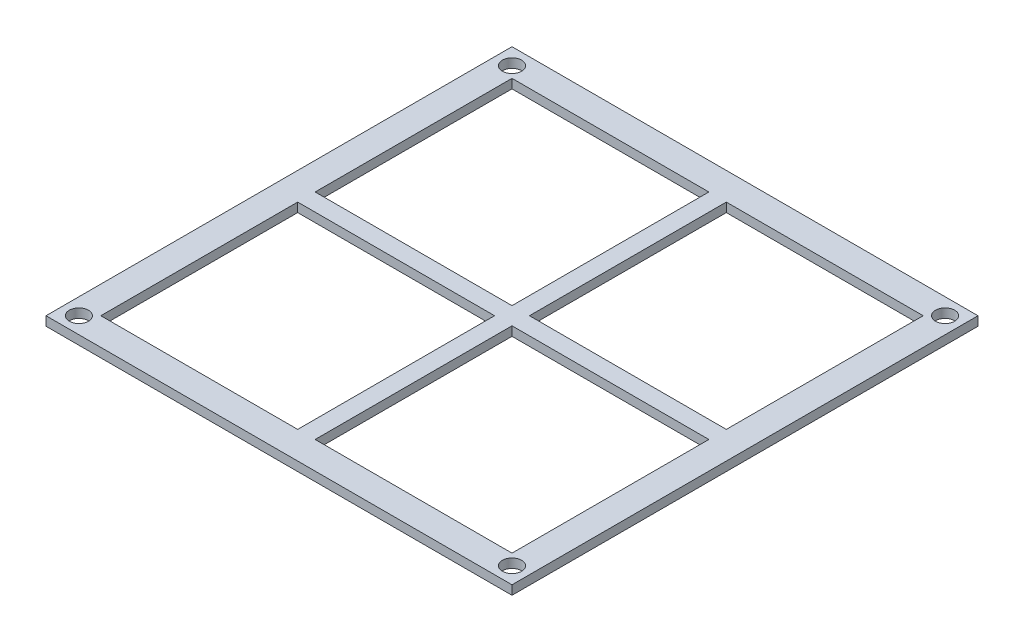
ISO-10303-21;
HEADER;
FILE_DESCRIPTION(('STEP AP214'),'2;1');
FILE_NAME('part.step','',(''),(''),'','','');
FILE_SCHEMA(('AUTOMOTIVE_DESIGN { 1 0 10303 214 1 1 1 1 }'));
ENDSEC;
DATA;
#1=APPLICATION_CONTEXT('core data for automotive mechanical design processes');
#2=APPLICATION_PROTOCOL_DEFINITION('international standard','automotive_design',2000,#1);
#3=PRODUCT_CONTEXT('',#1,'mechanical');
#4=PRODUCT('Part','Part','',(#3));
#5=PRODUCT_RELATED_PRODUCT_CATEGORY('part','',(#4));
#6=PRODUCT_DEFINITION_FORMATION('','',#4);
#7=PRODUCT_DEFINITION_CONTEXT('part definition',#1,'design');
#8=PRODUCT_DEFINITION('design','',#6,#7);
#9=PRODUCT_DEFINITION_SHAPE('','',#8);
#10=(LENGTH_UNIT() NAMED_UNIT(*) SI_UNIT(.MILLI.,.METRE.));
#11=(NAMED_UNIT(*) PLANE_ANGLE_UNIT() SI_UNIT($,.RADIAN.));
#12=(NAMED_UNIT(*) SI_UNIT($,.STERADIAN.) SOLID_ANGLE_UNIT());
#13=UNCERTAINTY_MEASURE_WITH_UNIT(LENGTH_MEASURE(1.E-05),#10,'distance_accuracy_value','');
#14=(GEOMETRIC_REPRESENTATION_CONTEXT(3) GLOBAL_UNCERTAINTY_ASSIGNED_CONTEXT((#13)) GLOBAL_UNIT_ASSIGNED_CONTEXT((#10,
#11,#12)) REPRESENTATION_CONTEXT('',''));
#15=CARTESIAN_POINT('',(0.,0.,0.));
#16=DIRECTION('',(0.,0.,1.));
#17=DIRECTION('',(1.,0.,0.));
#18=AXIS2_PLACEMENT_3D('',#15,#16,#17);
#19=CARTESIAN_POINT('',(0.,0.,0.));
#20=DIRECTION('',(0.,1.,0.));
#21=DIRECTION('',(0.,0.,1.));
#22=AXIS2_PLACEMENT_3D('',#19,#20,#21);
#23=PLANE('',#22);
#24=DIRECTION('',(-1.,0.,0.));
#25=VECTOR('',#24,1.);
#26=CARTESIAN_POINT('',(0.,0.,57.15));
#27=LINE('',#26,#25);
#28=CARTESIAN_POINT('',(-2.4263497335326,0.,57.15));
#29=VERTEX_POINT('',#28);
#30=CARTESIAN_POINT('',(-57.15,0.,57.15));
#31=VERTEX_POINT('',#30);
#32=EDGE_CURVE('E479',#29,#31,#27,.T.);
#33=ORIENTED_EDGE('',*,*,#32,.F.);
#34=DIRECTION('',(0.,0.,-1.));
#35=VECTOR('',#34,1.);
#36=CARTESIAN_POINT('',(-2.4263497335326,0.,0.));
#37=LINE('',#36,#35);
#38=CARTESIAN_POINT('',(-2.4263497335326,0.,2.4263497335326));
#39=VERTEX_POINT('',#38);
#40=EDGE_CURVE('E580',#29,#39,#37,.T.);
#41=ORIENTED_EDGE('',*,*,#40,.T.);
#42=DIRECTION('',(-1.,0.,0.));
#43=VECTOR('',#42,1.);
#44=CARTESIAN_POINT('',(0.,0.,2.4263497335326));
#45=LINE('',#44,#43);
#46=CARTESIAN_POINT('',(-57.15,0.,2.4263497335326));
#47=VERTEX_POINT('',#46);
#48=EDGE_CURVE('E471',#39,#47,#45,.T.);
#49=ORIENTED_EDGE('',*,*,#48,.T.);
#50=DIRECTION('',(0.,0.,-1.));
#51=VECTOR('',#50,1.);
#52=CARTESIAN_POINT('',(-57.15,0.,0.));
#53=LINE('',#52,#51);
#54=EDGE_CURVE('E476',#31,#47,#53,.T.);
#55=ORIENTED_EDGE('',*,*,#54,.F.);
#56=EDGE_LOOP('',(#33,#41,#49,#55));
#57=FACE_BOUND('',#56,.T.);
#58=DIRECTION('',(-1.,0.,0.));
#59=VECTOR('',#58,1.);
#60=CARTESIAN_POINT('',(0.,0.,-2.42634973353261));
#61=LINE('',#60,#59);
#62=CARTESIAN_POINT('',(-2.4263497335326,0.,-2.42634973353261));
#63=VERTEX_POINT('',#62);
#64=CARTESIAN_POINT('',(-57.15,0.,-2.42634973353261));
#65=VERTEX_POINT('',#64);
#66=EDGE_CURVE('E459',#63,#65,#61,.T.);
#67=ORIENTED_EDGE('',*,*,#66,.F.);
#68=DIRECTION('',(0.,0.,-1.));
#69=VECTOR('',#68,1.);
#70=CARTESIAN_POINT('',(-2.4263497335326,0.,64.77));
#71=LINE('',#70,#69);
#72=CARTESIAN_POINT('',(-2.4263497335326,0.,-57.15));
#73=VERTEX_POINT('',#72);
#74=EDGE_CURVE('E259',#63,#73,#71,.T.);
#75=ORIENTED_EDGE('',*,*,#74,.T.);
#76=DIRECTION('',(-1.,0.,0.));
#77=VECTOR('',#76,1.);
#78=CARTESIAN_POINT('',(0.,0.,-57.15));
#79=LINE('',#78,#77);
#80=CARTESIAN_POINT('',(-57.15,0.,-57.15));
#81=VERTEX_POINT('',#80);
#82=EDGE_CURVE('E416',#73,#81,#79,.T.);
#83=ORIENTED_EDGE('',*,*,#82,.T.);
#84=DIRECTION('',(0.,0.,-1.));
#85=VECTOR('',#84,1.);
#86=CARTESIAN_POINT('',(-57.15,0.,0.));
#87=LINE('',#86,#85);
#88=EDGE_CURVE('E422',#65,#81,#87,.T.);
#89=ORIENTED_EDGE('',*,*,#88,.F.);
#90=EDGE_LOOP('',(#67,#75,#83,#89));
#91=FACE_BOUND('',#90,.T.);
#92=DIRECTION('',(0.,0.,-1.));
#93=VECTOR('',#92,1.);
#94=CARTESIAN_POINT('',(2.42634973353263,0.,0.));
#95=LINE('',#94,#93);
#96=CARTESIAN_POINT('',(2.42634973353263,0.,57.15));
#97=VERTEX_POINT('',#96);
#98=CARTESIAN_POINT('',(2.42634973353263,0.,2.4263497335326));
#99=VERTEX_POINT('',#98);
#100=EDGE_CURVE('E506',#97,#99,#95,.T.);
#101=ORIENTED_EDGE('',*,*,#100,.F.);
#102=DIRECTION('',(-1.,0.,0.));
#103=VECTOR('',#102,1.);
#104=CARTESIAN_POINT('',(0.,0.,57.15));
#105=LINE('',#104,#103);
#106=CARTESIAN_POINT('',(57.15,0.,57.15));
#107=VERTEX_POINT('',#106);
#108=EDGE_CURVE('E526',#107,#97,#105,.T.);
#109=ORIENTED_EDGE('',*,*,#108,.F.);
#110=DIRECTION('',(0.,0.,-1.));
#111=VECTOR('',#110,1.);
#112=CARTESIAN_POINT('',(57.15,0.,0.));
#113=LINE('',#112,#111);
#114=CARTESIAN_POINT('',(57.15,0.,2.4263497335326));
#115=VERTEX_POINT('',#114);
#116=EDGE_CURVE('E529',#107,#115,#113,.T.);
#117=ORIENTED_EDGE('',*,*,#116,.T.);
#118=DIRECTION('',(-1.,0.,0.));
#119=VECTOR('',#118,1.);
#120=CARTESIAN_POINT('',(0.,0.,2.4263497335326));
#121=LINE('',#120,#119);
#122=EDGE_CURVE('E532',#115,#99,#121,.T.);
#123=ORIENTED_EDGE('',*,*,#122,.T.);
#124=EDGE_LOOP('',(#101,#109,#117,#123));
#125=FACE_BOUND('',#124,.T.);
#126=DIRECTION('',(0.,0.,-1.));
#127=VECTOR('',#126,1.);
#128=CARTESIAN_POINT('',(-64.77,0.,0.));
#129=LINE('',#128,#127);
#130=CARTESIAN_POINT('',(-64.77,0.,64.77));
#131=VERTEX_POINT('',#130);
#132=CARTESIAN_POINT('',(-64.77,0.,-64.77));
#133=VERTEX_POINT('',#132);
#134=EDGE_CURVE('E397',#131,#133,#129,.T.);
#135=ORIENTED_EDGE('',*,*,#134,.T.);
#136=DIRECTION('',(-1.,0.,0.));
#137=VECTOR('',#136,1.);
#138=CARTESIAN_POINT('',(0.,0.,-64.77));
#139=LINE('',#138,#137);
#140=CARTESIAN_POINT('',(64.77,0.,-64.77));
#141=VERTEX_POINT('',#140);
#142=EDGE_CURVE('E386',#141,#133,#139,.T.);
#143=ORIENTED_EDGE('',*,*,#142,.F.);
#144=DIRECTION('',(0.,0.,-1.));
#145=VECTOR('',#144,1.);
#146=CARTESIAN_POINT('',(64.77,0.,0.));
#147=LINE('',#146,#145);
#148=CARTESIAN_POINT('',(64.77,0.,64.77));
#149=VERTEX_POINT('',#148);
#150=EDGE_CURVE('E399',#149,#141,#147,.T.);
#151=ORIENTED_EDGE('',*,*,#150,.F.);
#152=DIRECTION('',(-1.,0.,0.));
#153=VECTOR('',#152,1.);
#154=CARTESIAN_POINT('',(0.,0.,64.77));
#155=LINE('',#154,#153);
#156=EDGE_CURVE('E393',#149,#131,#155,.T.);
#157=ORIENTED_EDGE('',*,*,#156,.T.);
#158=EDGE_LOOP('',(#135,#143,#151,#157));
#159=FACE_BOUND('',#158,.T.);
#160=DIRECTION('',(-1.,0.,0.));
#161=VECTOR('',#160,1.);
#162=CARTESIAN_POINT('',(0.,0.,-57.15));
#163=LINE('',#162,#161);
#164=CARTESIAN_POINT('',(57.15,0.,-57.15));
#165=VERTEX_POINT('',#164);
#166=CARTESIAN_POINT('',(2.42634973353263,0.,-57.15));
#167=VERTEX_POINT('',#166);
#168=EDGE_CURVE('E541',#165,#167,#163,.T.);
#169=ORIENTED_EDGE('',*,*,#168,.T.);
#170=DIRECTION('',(0.,0.,-1.));
#171=VECTOR('',#170,1.);
#172=CARTESIAN_POINT('',(2.42634973353263,0.,64.77));
#173=LINE('',#172,#171);
#174=CARTESIAN_POINT('',(2.42634973353263,0.,-2.42634973353261));
#175=VERTEX_POINT('',#174);
#176=EDGE_CURVE('E447',#175,#167,#173,.T.);
#177=ORIENTED_EDGE('',*,*,#176,.F.);
#178=DIRECTION('',(-1.,0.,0.));
#179=VECTOR('',#178,1.);
#180=CARTESIAN_POINT('',(0.,0.,-2.42634973353261));
#181=LINE('',#180,#179);
#182=CARTESIAN_POINT('',(57.15,0.,-2.42634973353261));
#183=VERTEX_POINT('',#182);
#184=EDGE_CURVE('E535',#183,#175,#181,.T.);
#185=ORIENTED_EDGE('',*,*,#184,.F.);
#186=DIRECTION('',(0.,0.,-1.));
#187=VECTOR('',#186,1.);
#188=CARTESIAN_POINT('',(57.15,0.,0.));
#189=LINE('',#188,#187);
#190=EDGE_CURVE('E538',#183,#165,#189,.T.);
#191=ORIENTED_EDGE('',*,*,#190,.T.);
#192=EDGE_LOOP('',(#169,#177,#185,#191));
#193=FACE_BOUND('',#192,.T.);
#194=CARTESIAN_POINT('',(60.198,0.,60.198));
#195=DIRECTION('',(0.,1.,0.));
#196=DIRECTION('',(0.,0.,1.));
#197=AXIS2_PLACEMENT_3D('',#194,#195,#196);
#198=CIRCLE('',#197,2.667);
#199=CARTESIAN_POINT('',(60.198,0.,62.865));
#200=VERTEX_POINT('',#199);
#201=EDGE_CURVE('E401',#200,#200,#198,.T.);
#202=ORIENTED_EDGE('',*,*,#201,.T.);
#203=EDGE_LOOP('',(#202));
#204=FACE_BOUND('',#203,.T.);
#205=CARTESIAN_POINT('',(60.198,0.,-60.198));
#206=DIRECTION('',(0.,1.,0.));
#207=DIRECTION('',(0.,0.,1.));
#208=AXIS2_PLACEMENT_3D('',#205,#206,#207);
#209=CIRCLE('',#208,2.667);
#210=CARTESIAN_POINT('',(60.198,0.,-57.531));
#211=VERTEX_POINT('',#210);
#212=EDGE_CURVE('E522',#211,#211,#209,.T.);
#213=ORIENTED_EDGE('',*,*,#212,.T.);
#214=EDGE_LOOP('',(#213));
#215=FACE_BOUND('',#214,.T.);
#216=CARTESIAN_POINT('',(-60.198,0.,60.198));
#217=DIRECTION('',(0.,1.,0.));
#218=DIRECTION('',(0.,0.,1.));
#219=AXIS2_PLACEMENT_3D('',#216,#217,#218);
#220=CIRCLE('',#219,2.667);
#221=CARTESIAN_POINT('',(-60.198,0.,62.865));
#222=VERTEX_POINT('',#221);
#223=EDGE_CURVE('E446',#222,#222,#220,.T.);
#224=ORIENTED_EDGE('',*,*,#223,.T.);
#225=EDGE_LOOP('',(#224));
#226=FACE_BOUND('',#225,.T.);
#227=CARTESIAN_POINT('',(-60.198,0.,-60.198));
#228=DIRECTION('',(0.,1.,0.));
#229=DIRECTION('',(0.,0.,1.));
#230=AXIS2_PLACEMENT_3D('',#227,#228,#229);
#231=CIRCLE('',#230,2.667);
#232=CARTESIAN_POINT('',(-60.198,0.,-57.531));
#233=VERTEX_POINT('',#232);
#234=EDGE_CURVE('E415',#233,#233,#231,.T.);
#235=ORIENTED_EDGE('',*,*,#234,.T.);
#236=EDGE_LOOP('',(#235));
#237=FACE_BOUND('',#236,.T.);
#238=ADVANCED_FACE('F255',(#57,#91,#125,#159,#193,#204,#215,#226,#237),#23,.F.);
#239=CARTESIAN_POINT('',(2.42634973353263,2.54,0.));
#240=DIRECTION('',(-1.,0.,0.));
#241=DIRECTION('',(0.,0.,1.));
#242=AXIS2_PLACEMENT_3D('',#239,#240,#241);
#243=PLANE('',#242);
#244=ORIENTED_EDGE('',*,*,#100,.T.);
#245=DIRECTION('',(0.,-1.,0.));
#246=VECTOR('',#245,1.);
#247=CARTESIAN_POINT('',(2.42634973353263,2.54,2.4263497335326));
#248=LINE('',#247,#246);
#249=CARTESIAN_POINT('',(2.42634973353263,2.54,2.4263497335326));
#250=VERTEX_POINT('',#249);
#251=EDGE_CURVE('E265',#250,#99,#248,.T.);
#252=ORIENTED_EDGE('',*,*,#251,.F.);
#253=DIRECTION('',(0.,0.,-1.));
#254=VECTOR('',#253,1.);
#255=CARTESIAN_POINT('',(2.42634973353263,2.54,0.));
#256=LINE('',#255,#254);
#257=CARTESIAN_POINT('',(2.42634973353263,2.54,57.15));
#258=VERTEX_POINT('',#257);
#259=EDGE_CURVE('E583',#258,#250,#256,.T.);
#260=ORIENTED_EDGE('',*,*,#259,.F.);
#261=DIRECTION('',(0.,-1.,0.));
#262=VECTOR('',#261,1.);
#263=CARTESIAN_POINT('',(2.42634973353263,2.54,57.15));
#264=LINE('',#263,#262);
#265=EDGE_CURVE('E12',#258,#97,#264,.T.);
#266=ORIENTED_EDGE('',*,*,#265,.T.);
#267=EDGE_LOOP('',(#244,#252,#260,#266));
#268=FACE_BOUND('',#267,.T.);
#269=ADVANCED_FACE('F597',(#268),#243,.F.);
#270=CARTESIAN_POINT('',(-2.4263497335326,2.54,0.));
#271=DIRECTION('',(-1.,0.,0.));
#272=DIRECTION('',(0.,0.,1.));
#273=AXIS2_PLACEMENT_3D('',#270,#271,#272);
#274=PLANE('',#273);
#275=ORIENTED_EDGE('',*,*,#40,.F.);
#276=DIRECTION('',(0.,-1.,0.));
#277=VECTOR('',#276,1.);
#278=CARTESIAN_POINT('',(-2.4263497335326,2.54,57.15));
#279=LINE('',#278,#277);
#280=CARTESIAN_POINT('',(-2.4263497335326,2.54,57.15));
#281=VERTEX_POINT('',#280);
#282=EDGE_CURVE('E274',#281,#29,#279,.T.);
#283=ORIENTED_EDGE('',*,*,#282,.F.);
#284=DIRECTION('',(0.,0.,-1.));
#285=VECTOR('',#284,1.);
#286=CARTESIAN_POINT('',(-2.4263497335326,2.54,0.));
#287=LINE('',#286,#285);
#288=CARTESIAN_POINT('',(-2.4263497335326,2.54,2.4263497335326));
#289=VERTEX_POINT('',#288);
#290=EDGE_CURVE('E579',#281,#289,#287,.T.);
#291=ORIENTED_EDGE('',*,*,#290,.T.);
#292=DIRECTION('',(0.,-1.,0.));
#293=VECTOR('',#292,1.);
#294=CARTESIAN_POINT('',(-2.4263497335326,2.54,2.4263497335326));
#295=LINE('',#294,#293);
#296=EDGE_CURVE('E576',#289,#39,#295,.T.);
#297=ORIENTED_EDGE('',*,*,#296,.T.);
#298=EDGE_LOOP('',(#275,#283,#291,#297));
#299=FACE_BOUND('',#298,.T.);
#300=ADVANCED_FACE('F626',(#299),#274,.T.);
#301=CARTESIAN_POINT('',(0.,2.54,0.));
#302=DIRECTION('',(0.,1.,0.));
#303=DIRECTION('',(0.,0.,1.));
#304=AXIS2_PLACEMENT_3D('',#301,#302,#303);
#305=PLANE('',#304);
#306=ORIENTED_EDGE('',*,*,#290,.F.);
#307=DIRECTION('',(-1.,0.,0.));
#308=VECTOR('',#307,1.);
#309=CARTESIAN_POINT('',(0.,2.54,57.15));
#310=LINE('',#309,#308);
#311=CARTESIAN_POINT('',(-57.15,2.54,57.15));
#312=VERTEX_POINT('',#311);
#313=EDGE_CURVE('E499',#281,#312,#310,.T.);
#314=ORIENTED_EDGE('',*,*,#313,.T.);
#315=DIRECTION('',(0.,0.,-1.));
#316=VECTOR('',#315,1.);
#317=CARTESIAN_POINT('',(-57.15,2.54,0.));
#318=LINE('',#317,#316);
#319=CARTESIAN_POINT('',(-57.15,2.54,2.4263497335326));
#320=VERTEX_POINT('',#319);
#321=EDGE_CURVE('E497',#312,#320,#318,.T.);
#322=ORIENTED_EDGE('',*,*,#321,.T.);
#323=DIRECTION('',(-1.,0.,0.));
#324=VECTOR('',#323,1.);
#325=CARTESIAN_POINT('',(0.,2.54,2.4263497335326));
#326=LINE('',#325,#324);
#327=EDGE_CURVE('E494',#289,#320,#326,.T.);
#328=ORIENTED_EDGE('',*,*,#327,.F.);
#329=EDGE_LOOP('',(#306,#314,#322,#328));
#330=FACE_BOUND('',#329,.T.);
#331=DIRECTION('',(0.,0.,-1.));
#332=VECTOR('',#331,1.);
#333=CARTESIAN_POINT('',(-2.4263497335326,2.54,64.77));
#334=LINE('',#333,#332);
#335=CARTESIAN_POINT('',(-2.4263497335326,2.54,-2.42634973353261));
#336=VERTEX_POINT('',#335);
#337=CARTESIAN_POINT('',(-2.4263497335326,2.54,-57.15));
#338=VERTEX_POINT('',#337);
#339=EDGE_CURVE('E444',#336,#338,#334,.T.);
#340=ORIENTED_EDGE('',*,*,#339,.F.);
#341=DIRECTION('',(-1.,0.,0.));
#342=VECTOR('',#341,1.);
#343=CARTESIAN_POINT('',(0.,2.54,-2.42634973353261));
#344=LINE('',#343,#342);
#345=CARTESIAN_POINT('',(-57.15,2.54,-2.42634973353261));
#346=VERTEX_POINT('',#345);
#347=EDGE_CURVE('E491',#336,#346,#344,.T.);
#348=ORIENTED_EDGE('',*,*,#347,.T.);
#349=DIRECTION('',(0.,0.,-1.));
#350=VECTOR('',#349,1.);
#351=CARTESIAN_POINT('',(-57.15,2.54,0.));
#352=LINE('',#351,#350);
#353=CARTESIAN_POINT('',(-57.15,2.54,-57.15));
#354=VERTEX_POINT('',#353);
#355=EDGE_CURVE('E489',#346,#354,#352,.T.);
#356=ORIENTED_EDGE('',*,*,#355,.T.);
#357=DIRECTION('',(-1.,0.,0.));
#358=VECTOR('',#357,1.);
#359=CARTESIAN_POINT('',(0.,2.54,-57.15));
#360=LINE('',#359,#358);
#361=EDGE_CURVE('E467',#338,#354,#360,.T.);
#362=ORIENTED_EDGE('',*,*,#361,.F.);
#363=EDGE_LOOP('',(#340,#348,#356,#362));
#364=FACE_BOUND('',#363,.T.);
#365=DIRECTION('',(-1.,0.,0.));
#366=VECTOR('',#365,1.);
#367=CARTESIAN_POINT('',(0.,2.54,57.15));
#368=LINE('',#367,#366);
#369=CARTESIAN_POINT('',(57.15,2.54,57.15));
#370=VERTEX_POINT('',#369);
#371=EDGE_CURVE('E549',#370,#258,#368,.T.);
#372=ORIENTED_EDGE('',*,*,#371,.T.);
#373=ORIENTED_EDGE('',*,*,#259,.T.);
#374=DIRECTION('',(-1.,0.,0.));
#375=VECTOR('',#374,1.);
#376=CARTESIAN_POINT('',(0.,2.54,2.4263497335326));
#377=LINE('',#376,#375);
#378=CARTESIAN_POINT('',(57.15,2.54,2.4263497335326));
#379=VERTEX_POINT('',#378);
#380=EDGE_CURVE('E555',#379,#250,#377,.T.);
#381=ORIENTED_EDGE('',*,*,#380,.F.);
#382=DIRECTION('',(0.,0.,-1.));
#383=VECTOR('',#382,1.);
#384=CARTESIAN_POINT('',(57.15,2.54,0.));
#385=LINE('',#384,#383);
#386=EDGE_CURVE('E552',#370,#379,#385,.T.);
#387=ORIENTED_EDGE('',*,*,#386,.F.);
#388=EDGE_LOOP('',(#372,#373,#381,#387));
#389=FACE_BOUND('',#388,.T.);
#390=DIRECTION('',(-1.,0.,0.));
#391=VECTOR('',#390,1.);
#392=CARTESIAN_POINT('',(0.,2.54,-64.77));
#393=LINE('',#392,#391);
#394=CARTESIAN_POINT('',(64.77,2.54,-64.77));
#395=VERTEX_POINT('',#394);
#396=CARTESIAN_POINT('',(-64.77,2.54,-64.77));
#397=VERTEX_POINT('',#396);
#398=EDGE_CURVE('E567',#395,#397,#393,.T.);
#399=ORIENTED_EDGE('',*,*,#398,.T.);
#400=DIRECTION('',(0.,0.,-1.));
#401=VECTOR('',#400,1.);
#402=CARTESIAN_POINT('',(-64.77,2.54,0.));
#403=LINE('',#402,#401);
#404=CARTESIAN_POINT('',(-64.77,2.54,64.77));
#405=VERTEX_POINT('',#404);
#406=EDGE_CURVE('E486',#405,#397,#403,.T.);
#407=ORIENTED_EDGE('',*,*,#406,.F.);
#408=DIRECTION('',(-1.,0.,0.));
#409=VECTOR('',#408,1.);
#410=CARTESIAN_POINT('',(0.,2.54,64.77));
#411=LINE('',#410,#409);
#412=CARTESIAN_POINT('',(64.77,2.54,64.77));
#413=VERTEX_POINT('',#412);
#414=EDGE_CURVE('E407',#413,#405,#411,.T.);
#415=ORIENTED_EDGE('',*,*,#414,.F.);
#416=DIRECTION('',(0.,0.,-1.));
#417=VECTOR('',#416,1.);
#418=CARTESIAN_POINT('',(64.77,2.54,0.));
#419=LINE('',#418,#417);
#420=EDGE_CURVE('E569',#413,#395,#419,.T.);
#421=ORIENTED_EDGE('',*,*,#420,.T.);
#422=EDGE_LOOP('',(#399,#407,#415,#421));
#423=FACE_BOUND('',#422,.T.);
#424=DIRECTION('',(0.,0.,-1.));
#425=VECTOR('',#424,1.);
#426=CARTESIAN_POINT('',(2.42634973353263,2.54,64.77));
#427=LINE('',#426,#425);
#428=CARTESIAN_POINT('',(2.42634973353263,2.54,-2.42634973353261));
#429=VERTEX_POINT('',#428);
#430=CARTESIAN_POINT('',(2.42634973353263,2.54,-57.15));
#431=VERTEX_POINT('',#430);
#432=EDGE_CURVE('E441',#429,#431,#427,.T.);
#433=ORIENTED_EDGE('',*,*,#432,.T.);
#434=DIRECTION('',(-1.,0.,0.));
#435=VECTOR('',#434,1.);
#436=CARTESIAN_POINT('',(0.,2.54,-57.15));
#437=LINE('',#436,#435);
#438=CARTESIAN_POINT('',(57.15,2.54,-57.15));
#439=VERTEX_POINT('',#438);
#440=EDGE_CURVE('E564',#439,#431,#437,.T.);
#441=ORIENTED_EDGE('',*,*,#440,.F.);
#442=DIRECTION('',(0.,0.,-1.));
#443=VECTOR('',#442,1.);
#444=CARTESIAN_POINT('',(57.15,2.54,0.));
#445=LINE('',#444,#443);
#446=CARTESIAN_POINT('',(57.15,2.54,-2.42634973353261));
#447=VERTEX_POINT('',#446);
#448=EDGE_CURVE('E561',#447,#439,#445,.T.);
#449=ORIENTED_EDGE('',*,*,#448,.F.);
#450=DIRECTION('',(-1.,0.,0.));
#451=VECTOR('',#450,1.);
#452=CARTESIAN_POINT('',(0.,2.54,-2.42634973353261));
#453=LINE('',#452,#451);
#454=EDGE_CURVE('E558',#447,#429,#453,.T.);
#455=ORIENTED_EDGE('',*,*,#454,.T.);
#456=EDGE_LOOP('',(#433,#441,#449,#455));
#457=FACE_BOUND('',#456,.T.);
#458=CARTESIAN_POINT('',(60.198,2.54,60.198));
#459=DIRECTION('',(0.,1.,0.));
#460=DIRECTION('',(0.,0.,1.));
#461=AXIS2_PLACEMENT_3D('',#458,#459,#460);
#462=CIRCLE('',#461,2.667);
#463=CARTESIAN_POINT('',(60.198,2.54,62.865));
#464=VERTEX_POINT('',#463);
#465=EDGE_CURVE('E525',#464,#464,#462,.T.);
#466=ORIENTED_EDGE('',*,*,#465,.F.);
#467=EDGE_LOOP('',(#466));
#468=FACE_BOUND('',#467,.T.);
#469=CARTESIAN_POINT('',(60.198,2.54,-60.198));
#470=DIRECTION('',(0.,1.,0.));
#471=DIRECTION('',(0.,0.,1.));
#472=AXIS2_PLACEMENT_3D('',#469,#470,#471);
#473=CIRCLE('',#472,2.667);
#474=CARTESIAN_POINT('',(60.198,2.54,-57.531));
#475=VERTEX_POINT('',#474);
#476=EDGE_CURVE('E521',#475,#475,#473,.T.);
#477=ORIENTED_EDGE('',*,*,#476,.F.);
#478=EDGE_LOOP('',(#477));
#479=FACE_BOUND('',#478,.T.);
#480=CARTESIAN_POINT('',(-60.198,2.54,60.198));
#481=DIRECTION('',(0.,1.,0.));
#482=DIRECTION('',(0.,0.,1.));
#483=AXIS2_PLACEMENT_3D('',#480,#481,#482);
#484=CIRCLE('',#483,2.667);
#485=CARTESIAN_POINT('',(-60.198,2.54,62.865));
#486=VERTEX_POINT('',#485);
#487=EDGE_CURVE('E419',#486,#486,#484,.T.);
#488=ORIENTED_EDGE('',*,*,#487,.F.);
#489=EDGE_LOOP('',(#488));
#490=FACE_BOUND('',#489,.T.);
#491=CARTESIAN_POINT('',(-60.198,2.54,-60.198));
#492=DIRECTION('',(0.,1.,0.));
#493=DIRECTION('',(0.,0.,1.));
#494=AXIS2_PLACEMENT_3D('',#491,#492,#493);
#495=CIRCLE('',#494,2.667);
#496=CARTESIAN_POINT('',(-60.198,2.54,-57.531));
#497=VERTEX_POINT('',#496);
#498=EDGE_CURVE('E412',#497,#497,#495,.T.);
#499=ORIENTED_EDGE('',*,*,#498,.F.);
#500=EDGE_LOOP('',(#499));
#501=FACE_BOUND('',#500,.T.);
#502=ADVANCED_FACE('F591',(#330,#364,#389,#423,#457,#468,#479,#490,#501),#305,.T.);
#503=CARTESIAN_POINT('',(-60.198,2.54,-60.198));
#504=DIRECTION('',(0.,-1.,0.));
#505=DIRECTION('',(0.,0.,-1.));
#506=AXIS2_PLACEMENT_3D('',#503,#504,#505);
#507=CYLINDRICAL_SURFACE('',#506,2.667);
#508=ORIENTED_EDGE('',*,*,#498,.T.);
#509=EDGE_LOOP('',(#508));
#510=FACE_BOUND('',#509,.T.);
#511=ORIENTED_EDGE('',*,*,#234,.F.);
#512=EDGE_LOOP('',(#511));
#513=FACE_BOUND('',#512,.T.);
#514=ADVANCED_FACE('F635',(#510,#513),#507,.F.);
#515=CARTESIAN_POINT('',(0.,2.54,-2.42634973353261));
#516=DIRECTION('',(0.,0.,1.));
#517=DIRECTION('',(1.,0.,0.));
#518=AXIS2_PLACEMENT_3D('',#515,#516,#517);
#519=PLANE('',#518);
#520=ORIENTED_EDGE('',*,*,#66,.T.);
#521=DIRECTION('',(0.,-1.,0.));
#522=VECTOR('',#521,1.);
#523=CARTESIAN_POINT('',(-57.15,2.54,-2.42634973353261));
#524=LINE('',#523,#522);
#525=EDGE_CURVE('E431',#346,#65,#524,.T.);
#526=ORIENTED_EDGE('',*,*,#525,.F.);
#527=ORIENTED_EDGE('',*,*,#347,.F.);
#528=DIRECTION('',(0.,-1.,0.));
#529=VECTOR('',#528,1.);
#530=CARTESIAN_POINT('',(-2.4263497335326,2.54,-2.42634973353261));
#531=LINE('',#530,#529);
#532=EDGE_CURVE('E434',#336,#63,#531,.T.);
#533=ORIENTED_EDGE('',*,*,#532,.T.);
#534=EDGE_LOOP('',(#520,#526,#527,#533));
#535=FACE_BOUND('',#534,.T.);
#536=ADVANCED_FACE('F675',(#535),#519,.F.);
#537=CARTESIAN_POINT('',(-57.15,2.54,0.));
#538=DIRECTION('',(-1.,0.,0.));
#539=DIRECTION('',(0.,0.,1.));
#540=AXIS2_PLACEMENT_3D('',#537,#538,#539);
#541=PLANE('',#540);
#542=ORIENTED_EDGE('',*,*,#88,.T.);
#543=DIRECTION('',(0.,-1.,0.));
#544=VECTOR('',#543,1.);
#545=CARTESIAN_POINT('',(-57.15,2.54,-57.15));
#546=LINE('',#545,#544);
#547=EDGE_CURVE('E429',#354,#81,#546,.T.);
#548=ORIENTED_EDGE('',*,*,#547,.F.);
#549=ORIENTED_EDGE('',*,*,#355,.F.);
#550=ORIENTED_EDGE('',*,*,#525,.T.);
#551=EDGE_LOOP('',(#542,#548,#549,#550));
#552=FACE_BOUND('',#551,.T.);
#553=ADVANCED_FACE('F469',(#552),#541,.F.);
#554=CARTESIAN_POINT('',(0.,2.54,-57.15));
#555=DIRECTION('',(0.,0.,1.));
#556=DIRECTION('',(1.,0.,0.));
#557=AXIS2_PLACEMENT_3D('',#554,#555,#556);
#558=PLANE('',#557);
#559=ORIENTED_EDGE('',*,*,#82,.F.);
#560=DIRECTION('',(0.,-1.,0.));
#561=VECTOR('',#560,1.);
#562=CARTESIAN_POINT('',(-2.4263497335326,2.54,-57.15));
#563=LINE('',#562,#561);
#564=EDGE_CURVE('E427',#338,#73,#563,.T.);
#565=ORIENTED_EDGE('',*,*,#564,.F.);
#566=ORIENTED_EDGE('',*,*,#361,.T.);
#567=ORIENTED_EDGE('',*,*,#547,.T.);
#568=EDGE_LOOP('',(#559,#565,#566,#567));
#569=FACE_BOUND('',#568,.T.);
#570=ADVANCED_FACE('F462',(#569),#558,.T.);
#571=CARTESIAN_POINT('',(-64.77,2.54,0.));
#572=DIRECTION('',(-1.,0.,0.));
#573=DIRECTION('',(0.,0.,1.));
#574=AXIS2_PLACEMENT_3D('',#571,#572,#573);
#575=PLANE('',#574);
#576=ORIENTED_EDGE('',*,*,#134,.F.);
#577=DIRECTION('',(0.,-1.,0.));
#578=VECTOR('',#577,1.);
#579=CARTESIAN_POINT('',(-64.77,2.54,64.77));
#580=LINE('',#579,#578);
#581=EDGE_CURVE('E404',#405,#131,#580,.T.);
#582=ORIENTED_EDGE('',*,*,#581,.F.);
#583=ORIENTED_EDGE('',*,*,#406,.T.);
#584=DIRECTION('',(0.,-1.,0.));
#585=VECTOR('',#584,1.);
#586=CARTESIAN_POINT('',(-64.77,2.54,-64.77));
#587=LINE('',#586,#585);
#588=EDGE_CURVE('E411',#397,#133,#587,.T.);
#589=ORIENTED_EDGE('',*,*,#588,.T.);
#590=EDGE_LOOP('',(#576,#582,#583,#589));
#591=FACE_BOUND('',#590,.T.);
#592=ADVANCED_FACE('F414',(#591),#575,.T.);
#593=CARTESIAN_POINT('',(-60.198,2.54,60.198));
#594=DIRECTION('',(0.,-1.,0.));
#595=DIRECTION('',(0.,0.,-1.));
#596=AXIS2_PLACEMENT_3D('',#593,#594,#595);
#597=CYLINDRICAL_SURFACE('',#596,2.667);
#598=ORIENTED_EDGE('',*,*,#487,.T.);
#599=EDGE_LOOP('',(#598));
#600=FACE_BOUND('',#599,.T.);
#601=ORIENTED_EDGE('',*,*,#223,.F.);
#602=EDGE_LOOP('',(#601));
#603=FACE_BOUND('',#602,.T.);
#604=ADVANCED_FACE('F639',(#600,#603),#597,.F.);
#605=CARTESIAN_POINT('',(60.198,2.54,-60.198));
#606=DIRECTION('',(0.,-1.,0.));
#607=DIRECTION('',(0.,0.,-1.));
#608=AXIS2_PLACEMENT_3D('',#605,#606,#607);
#609=CYLINDRICAL_SURFACE('',#608,2.667);
#610=ORIENTED_EDGE('',*,*,#476,.T.);
#611=EDGE_LOOP('',(#610));
#612=FACE_BOUND('',#611,.T.);
#613=ORIENTED_EDGE('',*,*,#212,.F.);
#614=EDGE_LOOP('',(#613));
#615=FACE_BOUND('',#614,.T.);
#616=ADVANCED_FACE('F637',(#612,#615),#609,.F.);
#617=CARTESIAN_POINT('',(0.,2.54,64.77));
#618=DIRECTION('',(0.,0.,1.));
#619=DIRECTION('',(1.,0.,0.));
#620=AXIS2_PLACEMENT_3D('',#617,#618,#619);
#621=PLANE('',#620);
#622=ORIENTED_EDGE('',*,*,#156,.F.);
#623=DIRECTION('',(0.,-1.,0.));
#624=VECTOR('',#623,1.);
#625=CARTESIAN_POINT('',(64.77,2.54,64.77));
#626=LINE('',#625,#624);
#627=EDGE_CURVE('E504',#413,#149,#626,.T.);
#628=ORIENTED_EDGE('',*,*,#627,.F.);
#629=ORIENTED_EDGE('',*,*,#414,.T.);
#630=ORIENTED_EDGE('',*,*,#581,.T.);
#631=EDGE_LOOP('',(#622,#628,#629,#630));
#632=FACE_BOUND('',#631,.T.);
#633=ADVANCED_FACE('F405',(#632),#621,.T.);
#634=CARTESIAN_POINT('',(64.77,2.54,0.));
#635=DIRECTION('',(-1.,0.,0.));
#636=DIRECTION('',(0.,0.,1.));
#637=AXIS2_PLACEMENT_3D('',#634,#635,#636);
#638=PLANE('',#637);
#639=ORIENTED_EDGE('',*,*,#150,.T.);
#640=DIRECTION('',(0.,-1.,0.));
#641=VECTOR('',#640,1.);
#642=CARTESIAN_POINT('',(64.77,2.54,-64.77));
#643=LINE('',#642,#641);
#644=EDGE_CURVE('E507',#395,#141,#643,.T.);
#645=ORIENTED_EDGE('',*,*,#644,.F.);
#646=ORIENTED_EDGE('',*,*,#420,.F.);
#647=ORIENTED_EDGE('',*,*,#627,.T.);
#648=EDGE_LOOP('',(#639,#645,#646,#647));
#649=FACE_BOUND('',#648,.T.);
#650=ADVANCED_FACE('F667',(#649),#638,.F.);
#651=CARTESIAN_POINT('',(0.,2.54,-64.77));
#652=DIRECTION('',(0.,0.,1.));
#653=DIRECTION('',(1.,0.,0.));
#654=AXIS2_PLACEMENT_3D('',#651,#652,#653);
#655=PLANE('',#654);
#656=ORIENTED_EDGE('',*,*,#142,.T.);
#657=ORIENTED_EDGE('',*,*,#588,.F.);
#658=ORIENTED_EDGE('',*,*,#398,.F.);
#659=ORIENTED_EDGE('',*,*,#644,.T.);
#660=EDGE_LOOP('',(#656,#657,#658,#659));
#661=FACE_BOUND('',#660,.T.);
#662=ADVANCED_FACE('F663',(#661),#655,.F.);
#663=CARTESIAN_POINT('',(0.,2.54,-57.15));
#664=DIRECTION('',(0.,0.,1.));
#665=DIRECTION('',(1.,0.,0.));
#666=AXIS2_PLACEMENT_3D('',#663,#664,#665);
#667=PLANE('',#666);
#668=ORIENTED_EDGE('',*,*,#168,.F.);
#669=DIRECTION('',(0.,-1.,0.));
#670=VECTOR('',#669,1.);
#671=CARTESIAN_POINT('',(57.15,2.54,-57.15));
#672=LINE('',#671,#670);
#673=EDGE_CURVE('E511',#439,#165,#672,.T.);
#674=ORIENTED_EDGE('',*,*,#673,.F.);
#675=ORIENTED_EDGE('',*,*,#440,.T.);
#676=DIRECTION('',(0.,-1.,0.));
#677=VECTOR('',#676,1.);
#678=CARTESIAN_POINT('',(2.42634973353263,2.54,-57.15));
#679=LINE('',#678,#677);
#680=EDGE_CURVE('E509',#431,#167,#679,.T.);
#681=ORIENTED_EDGE('',*,*,#680,.T.);
#682=EDGE_LOOP('',(#668,#674,#675,#681));
#683=FACE_BOUND('',#682,.T.);
#684=ADVANCED_FACE('F659',(#683),#667,.T.);
#685=CARTESIAN_POINT('',(57.15,2.54,0.));
#686=DIRECTION('',(-1.,0.,0.));
#687=DIRECTION('',(0.,0.,1.));
#688=AXIS2_PLACEMENT_3D('',#685,#686,#687);
#689=PLANE('',#688);
#690=ORIENTED_EDGE('',*,*,#190,.F.);
#691=DIRECTION('',(0.,-1.,0.));
#692=VECTOR('',#691,1.);
#693=CARTESIAN_POINT('',(57.15,2.54,-2.42634973353261));
#694=LINE('',#693,#692);
#695=EDGE_CURVE('E513',#447,#183,#694,.T.);
#696=ORIENTED_EDGE('',*,*,#695,.F.);
#697=ORIENTED_EDGE('',*,*,#448,.T.);
#698=ORIENTED_EDGE('',*,*,#673,.T.);
#699=EDGE_LOOP('',(#690,#696,#697,#698));
#700=FACE_BOUND('',#699,.T.);
#701=ADVANCED_FACE('F655',(#700),#689,.T.);
#702=CARTESIAN_POINT('',(0.,2.54,-2.42634973353261));
#703=DIRECTION('',(0.,0.,1.));
#704=DIRECTION('',(1.,0.,0.));
#705=AXIS2_PLACEMENT_3D('',#702,#703,#704);
#706=PLANE('',#705);
#707=ORIENTED_EDGE('',*,*,#184,.T.);
#708=DIRECTION('',(0.,-1.,0.));
#709=VECTOR('',#708,1.);
#710=CARTESIAN_POINT('',(2.42634973353263,2.54,-2.42634973353261));
#711=LINE('',#710,#709);
#712=EDGE_CURVE('E515',#429,#175,#711,.T.);
#713=ORIENTED_EDGE('',*,*,#712,.F.);
#714=ORIENTED_EDGE('',*,*,#454,.F.);
#715=ORIENTED_EDGE('',*,*,#695,.T.);
#716=EDGE_LOOP('',(#707,#713,#714,#715));
#717=FACE_BOUND('',#716,.T.);
#718=ADVANCED_FACE('F620',(#717),#706,.F.);
#719=CARTESIAN_POINT('',(60.198,2.54,60.198));
#720=DIRECTION('',(0.,-1.,0.));
#721=DIRECTION('',(0.,0.,-1.));
#722=AXIS2_PLACEMENT_3D('',#719,#720,#721);
#723=CYLINDRICAL_SURFACE('',#722,2.667);
#724=ORIENTED_EDGE('',*,*,#465,.T.);
#725=EDGE_LOOP('',(#724));
#726=FACE_BOUND('',#725,.T.);
#727=ORIENTED_EDGE('',*,*,#201,.F.);
#728=EDGE_LOOP('',(#727));
#729=FACE_BOUND('',#728,.T.);
#730=ADVANCED_FACE('F612',(#726,#729),#723,.F.);
#731=CARTESIAN_POINT('',(57.15,2.54,0.));
#732=DIRECTION('',(-1.,0.,0.));
#733=DIRECTION('',(0.,0.,1.));
#734=AXIS2_PLACEMENT_3D('',#731,#732,#733);
#735=PLANE('',#734);
#736=ORIENTED_EDGE('',*,*,#116,.F.);
#737=DIRECTION('',(0.,-1.,0.));
#738=VECTOR('',#737,1.);
#739=CARTESIAN_POINT('',(57.15,2.54,57.15));
#740=LINE('',#739,#738);
#741=EDGE_CURVE('E519',#370,#107,#740,.T.);
#742=ORIENTED_EDGE('',*,*,#741,.F.);
#743=ORIENTED_EDGE('',*,*,#386,.T.);
#744=DIRECTION('',(0.,-1.,0.));
#745=VECTOR('',#744,1.);
#746=CARTESIAN_POINT('',(57.15,2.54,2.4263497335326));
#747=LINE('',#746,#745);
#748=EDGE_CURVE('E517',#379,#115,#747,.T.);
#749=ORIENTED_EDGE('',*,*,#748,.T.);
#750=EDGE_LOOP('',(#736,#742,#743,#749));
#751=FACE_BOUND('',#750,.T.);
#752=ADVANCED_FACE('F609',(#751),#735,.T.);
#753=CARTESIAN_POINT('',(-57.15,2.54,0.));
#754=DIRECTION('',(-1.,0.,0.));
#755=DIRECTION('',(0.,0.,1.));
#756=AXIS2_PLACEMENT_3D('',#753,#754,#755);
#757=PLANE('',#756);
#758=ORIENTED_EDGE('',*,*,#54,.T.);
#759=DIRECTION('',(0.,-1.,0.));
#760=VECTOR('',#759,1.);
#761=CARTESIAN_POINT('',(-57.15,2.54,2.4263497335326));
#762=LINE('',#761,#760);
#763=EDGE_CURVE('E436',#320,#47,#762,.T.);
#764=ORIENTED_EDGE('',*,*,#763,.F.);
#765=ORIENTED_EDGE('',*,*,#321,.F.);
#766=DIRECTION('',(0.,-1.,0.));
#767=VECTOR('',#766,1.);
#768=CARTESIAN_POINT('',(-57.15,2.54,57.15));
#769=LINE('',#768,#767);
#770=EDGE_CURVE('E438',#312,#31,#769,.T.);
#771=ORIENTED_EDGE('',*,*,#770,.T.);
#772=EDGE_LOOP('',(#758,#764,#765,#771));
#773=FACE_BOUND('',#772,.T.);
#774=ADVANCED_FACE('F611',(#773),#757,.F.);
#775=CARTESIAN_POINT('',(2.42634973353263,2.54,64.77));
#776=DIRECTION('',(-1.,0.,0.));
#777=DIRECTION('',(0.,0.,1.));
#778=AXIS2_PLACEMENT_3D('',#775,#776,#777);
#779=PLANE('',#778);
#780=ORIENTED_EDGE('',*,*,#680,.F.);
#781=ORIENTED_EDGE('',*,*,#432,.F.);
#782=ORIENTED_EDGE('',*,*,#712,.T.);
#783=ORIENTED_EDGE('',*,*,#176,.T.);
#784=EDGE_LOOP('',(#780,#781,#782,#783));
#785=FACE_BOUND('',#784,.T.);
#786=ADVANCED_FACE('F257',(#785),#779,.F.);
#787=CARTESIAN_POINT('',(-2.4263497335326,2.54,64.77));
#788=DIRECTION('',(-1.,0.,0.));
#789=DIRECTION('',(0.,0.,1.));
#790=AXIS2_PLACEMENT_3D('',#787,#788,#789);
#791=PLANE('',#790);
#792=ORIENTED_EDGE('',*,*,#532,.F.);
#793=ORIENTED_EDGE('',*,*,#339,.T.);
#794=ORIENTED_EDGE('',*,*,#564,.T.);
#795=ORIENTED_EDGE('',*,*,#74,.F.);
#796=EDGE_LOOP('',(#792,#793,#794,#795));
#797=FACE_BOUND('',#796,.T.);
#798=ADVANCED_FACE('F687',(#797),#791,.T.);
#799=CARTESIAN_POINT('',(0.,2.54,2.4263497335326));
#800=DIRECTION('',(0.,0.,1.));
#801=DIRECTION('',(1.,0.,0.));
#802=AXIS2_PLACEMENT_3D('',#799,#800,#801);
#803=PLANE('',#802);
#804=ORIENTED_EDGE('',*,*,#48,.F.);
#805=ORIENTED_EDGE('',*,*,#296,.F.);
#806=ORIENTED_EDGE('',*,*,#327,.T.);
#807=ORIENTED_EDGE('',*,*,#763,.T.);
#808=EDGE_LOOP('',(#804,#805,#806,#807));
#809=FACE_BOUND('',#808,.T.);
#810=ADVANCED_FACE('F649',(#809),#803,.T.);
#811=CARTESIAN_POINT('',(0.,2.54,57.15));
#812=DIRECTION('',(0.,0.,1.));
#813=DIRECTION('',(1.,0.,0.));
#814=AXIS2_PLACEMENT_3D('',#811,#812,#813);
#815=PLANE('',#814);
#816=ORIENTED_EDGE('',*,*,#32,.T.);
#817=ORIENTED_EDGE('',*,*,#770,.F.);
#818=ORIENTED_EDGE('',*,*,#313,.F.);
#819=ORIENTED_EDGE('',*,*,#282,.T.);
#820=EDGE_LOOP('',(#816,#817,#818,#819));
#821=FACE_BOUND('',#820,.T.);
#822=ADVANCED_FACE('F645',(#821),#815,.F.);
#823=CARTESIAN_POINT('',(0.,2.54,2.4263497335326));
#824=DIRECTION('',(0.,0.,1.));
#825=DIRECTION('',(1.,0.,0.));
#826=AXIS2_PLACEMENT_3D('',#823,#824,#825);
#827=PLANE('',#826);
#828=ORIENTED_EDGE('',*,*,#122,.F.);
#829=ORIENTED_EDGE('',*,*,#748,.F.);
#830=ORIENTED_EDGE('',*,*,#380,.T.);
#831=ORIENTED_EDGE('',*,*,#251,.T.);
#832=EDGE_LOOP('',(#828,#829,#830,#831));
#833=FACE_BOUND('',#832,.T.);
#834=ADVANCED_FACE('F607',(#833),#827,.T.);
#835=CARTESIAN_POINT('',(0.,2.54,57.15));
#836=DIRECTION('',(0.,0.,1.));
#837=DIRECTION('',(1.,0.,0.));
#838=AXIS2_PLACEMENT_3D('',#835,#836,#837);
#839=PLANE('',#838);
#840=ORIENTED_EDGE('',*,*,#108,.T.);
#841=ORIENTED_EDGE('',*,*,#265,.F.);
#842=ORIENTED_EDGE('',*,*,#371,.F.);
#843=ORIENTED_EDGE('',*,*,#741,.T.);
#844=EDGE_LOOP('',(#840,#841,#842,#843));
#845=FACE_BOUND('',#844,.T.);
#846=ADVANCED_FACE('F601',(#845),#839,.F.);
#847=CLOSED_SHELL('',(#238,#269,#300,#502,#514,#536,#553,#570,#592,#604,#616,#633,#650,#662,
#684,#701,#718,#730,#752,#774,#786,#798,#810,#822,#834,#846));
#848=MANIFOLD_SOLID_BREP('B2',#847);
#849=ADVANCED_BREP_SHAPE_REPRESENTATION('',(#18,#848),#14);
#850=SHAPE_DEFINITION_REPRESENTATION(#9,#849);
ENDSEC;
END-ISO-10303-21;
